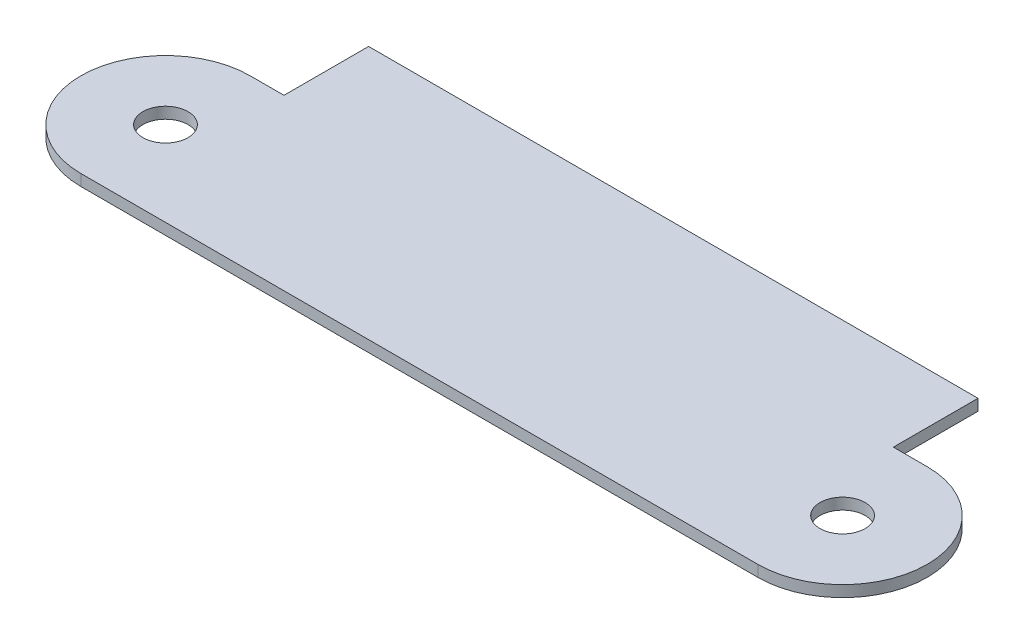
ISO-10303-21;
HEADER;
FILE_DESCRIPTION(('STEP AP214'),'2;1');
FILE_NAME('part.step','',(''),(''),'','','');
FILE_SCHEMA(('AUTOMOTIVE_DESIGN { 1 0 10303 214 1 1 1 1 }'));
ENDSEC;
DATA;
#1=APPLICATION_CONTEXT('core data for automotive mechanical design processes');
#2=APPLICATION_PROTOCOL_DEFINITION('international standard','automotive_design',2000,#1);
#3=PRODUCT_CONTEXT('',#1,'mechanical');
#4=PRODUCT('Part','Part','',(#3));
#5=PRODUCT_RELATED_PRODUCT_CATEGORY('part','',(#4));
#6=PRODUCT_DEFINITION_FORMATION('','',#4);
#7=PRODUCT_DEFINITION_CONTEXT('part definition',#1,'design');
#8=PRODUCT_DEFINITION('design','',#6,#7);
#9=PRODUCT_DEFINITION_SHAPE('','',#8);
#10=(LENGTH_UNIT() NAMED_UNIT(*) SI_UNIT(.MILLI.,.METRE.));
#11=(NAMED_UNIT(*) PLANE_ANGLE_UNIT() SI_UNIT($,.RADIAN.));
#12=(NAMED_UNIT(*) SI_UNIT($,.STERADIAN.) SOLID_ANGLE_UNIT());
#13=UNCERTAINTY_MEASURE_WITH_UNIT(LENGTH_MEASURE(1.E-05),#10,'distance_accuracy_value','');
#14=(GEOMETRIC_REPRESENTATION_CONTEXT(3) GLOBAL_UNCERTAINTY_ASSIGNED_CONTEXT((#13)) GLOBAL_UNIT_ASSIGNED_CONTEXT((#10,
#11,#12)) REPRESENTATION_CONTEXT('',''));
#15=CARTESIAN_POINT('',(0.,0.,0.));
#16=DIRECTION('',(0.,0.,1.));
#17=DIRECTION('',(1.,0.,0.));
#18=AXIS2_PLACEMENT_3D('',#15,#16,#17);
#19=CARTESIAN_POINT('',(60.,1.,0.));
#20=DIRECTION('',(0.,-1.,0.));
#21=DIRECTION('',(0.,0.,-1.));
#22=AXIS2_PLACEMENT_3D('',#19,#20,#21);
#23=CYLINDRICAL_SURFACE('',#22,7.5);
#24=CARTESIAN_POINT('',(60.,0.,0.));
#25=DIRECTION('',(0.,1.,0.));
#26=DIRECTION('',(0.,0.,1.));
#27=AXIS2_PLACEMENT_3D('',#24,#25,#26);
#28=CIRCLE('',#27,7.5);
#29=CARTESIAN_POINT('',(60.,0.,-7.5));
#30=VERTEX_POINT('',#29);
#31=CARTESIAN_POINT('',(60.,0.,7.5));
#32=VERTEX_POINT('',#31);
#33=EDGE_CURVE('E135',#30,#32,#28,.F.);
#34=ORIENTED_EDGE('',*,*,#33,.F.);
#35=DIRECTION('',(0.,-1.,0.));
#36=VECTOR('',#35,1.);
#37=CARTESIAN_POINT('',(60.,1.,-7.5));
#38=LINE('',#37,#36);
#39=CARTESIAN_POINT('',(60.,1.,-7.5));
#40=VERTEX_POINT('',#39);
#41=EDGE_CURVE('E11',#40,#30,#38,.T.);
#42=ORIENTED_EDGE('',*,*,#41,.F.);
#43=CARTESIAN_POINT('',(60.,1.,0.));
#44=DIRECTION('',(0.,1.,0.));
#45=DIRECTION('',(0.,0.,1.));
#46=AXIS2_PLACEMENT_3D('',#43,#44,#45);
#47=CIRCLE('',#46,7.5);
#48=CARTESIAN_POINT('',(60.,1.,7.5));
#49=VERTEX_POINT('',#48);
#50=EDGE_CURVE('E160',#40,#49,#47,.F.);
#51=ORIENTED_EDGE('',*,*,#50,.T.);
#52=DIRECTION('',(0.,-1.,0.));
#53=VECTOR('',#52,1.);
#54=CARTESIAN_POINT('',(60.,1.,7.5));
#55=LINE('',#54,#53);
#56=EDGE_CURVE('E84',#49,#32,#55,.T.);
#57=ORIENTED_EDGE('',*,*,#56,.T.);
#58=EDGE_LOOP('',(#34,#42,#51,#57));
#59=FACE_BOUND('',#58,.T.);
#60=ADVANCED_FACE('F34',(#59),#23,.T.);
#61=CARTESIAN_POINT('',(0.,1.,-7.5));
#62=DIRECTION('',(0.,0.,-1.));
#63=DIRECTION('',(-1.,0.,0.));
#64=AXIS2_PLACEMENT_3D('',#61,#62,#63);
#65=PLANE('',#64);
#66=DIRECTION('',(1.,0.,0.));
#67=VECTOR('',#66,1.);
#68=CARTESIAN_POINT('',(0.,0.,-7.5));
#69=LINE('',#68,#67);
#70=CARTESIAN_POINT('',(57.,0.,-7.5));
#71=VERTEX_POINT('',#70);
#72=EDGE_CURVE('E138',#71,#30,#69,.T.);
#73=ORIENTED_EDGE('',*,*,#72,.F.);
#74=DIRECTION('',(0.,-1.,0.));
#75=VECTOR('',#74,1.);
#76=CARTESIAN_POINT('',(57.,1.,-7.5));
#77=LINE('',#76,#75);
#78=CARTESIAN_POINT('',(57.,1.,-7.5));
#79=VERTEX_POINT('',#78);
#80=EDGE_CURVE('E42',#79,#71,#77,.T.);
#81=ORIENTED_EDGE('',*,*,#80,.F.);
#82=DIRECTION('',(1.,0.,0.));
#83=VECTOR('',#82,1.);
#84=CARTESIAN_POINT('',(0.,1.,-7.5));
#85=LINE('',#84,#83);
#86=EDGE_CURVE('E186',#79,#40,#85,.T.);
#87=ORIENTED_EDGE('',*,*,#86,.T.);
#88=ORIENTED_EDGE('',*,*,#41,.T.);
#89=EDGE_LOOP('',(#73,#81,#87,#88));
#90=FACE_BOUND('',#89,.T.);
#91=ADVANCED_FACE('F177',(#90),#65,.T.);
#92=CARTESIAN_POINT('',(57.,1.,0.));
#93=DIRECTION('',(1.,0.,0.));
#94=DIRECTION('',(0.,0.,-1.));
#95=AXIS2_PLACEMENT_3D('',#92,#93,#94);
#96=PLANE('',#95);
#97=DIRECTION('',(0.,0.,1.));
#98=VECTOR('',#97,1.);
#99=CARTESIAN_POINT('',(57.,0.,0.));
#100=LINE('',#99,#98);
#101=CARTESIAN_POINT('',(57.,0.,-15.));
#102=VERTEX_POINT('',#101);
#103=EDGE_CURVE('E141',#102,#71,#100,.T.);
#104=ORIENTED_EDGE('',*,*,#103,.F.);
#105=DIRECTION('',(0.,-1.,0.));
#106=VECTOR('',#105,1.);
#107=CARTESIAN_POINT('',(57.,1.,-15.));
#108=LINE('',#107,#106);
#109=CARTESIAN_POINT('',(57.,1.,-15.));
#110=VERTEX_POINT('',#109);
#111=EDGE_CURVE('E166',#110,#102,#108,.T.);
#112=ORIENTED_EDGE('',*,*,#111,.F.);
#113=DIRECTION('',(0.,0.,1.));
#114=VECTOR('',#113,1.);
#115=CARTESIAN_POINT('',(57.,1.,0.));
#116=LINE('',#115,#114);
#117=EDGE_CURVE('E173',#110,#79,#116,.T.);
#118=ORIENTED_EDGE('',*,*,#117,.T.);
#119=ORIENTED_EDGE('',*,*,#80,.T.);
#120=EDGE_LOOP('',(#104,#112,#118,#119));
#121=FACE_BOUND('',#120,.T.);
#122=ADVANCED_FACE('F171',(#121),#96,.T.);
#123=CARTESIAN_POINT('',(0.,1.,-15.));
#124=DIRECTION('',(0.,0.,-1.));
#125=DIRECTION('',(-1.,0.,0.));
#126=AXIS2_PLACEMENT_3D('',#123,#124,#125);
#127=PLANE('',#126);
#128=DIRECTION('',(1.,0.,0.));
#129=VECTOR('',#128,1.);
#130=CARTESIAN_POINT('',(0.,0.,-15.));
#131=LINE('',#130,#129);
#132=CARTESIAN_POINT('',(3.,0.,-15.));
#133=VERTEX_POINT('',#132);
#134=EDGE_CURVE('E144',#133,#102,#131,.T.);
#135=ORIENTED_EDGE('',*,*,#134,.F.);
#136=DIRECTION('',(0.,-1.,0.));
#137=VECTOR('',#136,1.);
#138=CARTESIAN_POINT('',(3.,1.,-15.));
#139=LINE('',#138,#137);
#140=CARTESIAN_POINT('',(3.,1.,-15.));
#141=VERTEX_POINT('',#140);
#142=EDGE_CURVE('E164',#141,#133,#139,.T.);
#143=ORIENTED_EDGE('',*,*,#142,.F.);
#144=DIRECTION('',(1.,0.,0.));
#145=VECTOR('',#144,1.);
#146=CARTESIAN_POINT('',(0.,1.,-15.));
#147=LINE('',#146,#145);
#148=EDGE_CURVE('E124',#141,#110,#147,.T.);
#149=ORIENTED_EDGE('',*,*,#148,.T.);
#150=ORIENTED_EDGE('',*,*,#111,.T.);
#151=EDGE_LOOP('',(#135,#143,#149,#150));
#152=FACE_BOUND('',#151,.T.);
#153=ADVANCED_FACE('F184',(#152),#127,.T.);
#154=CARTESIAN_POINT('',(3.,1.,0.));
#155=DIRECTION('',(-1.,0.,0.));
#156=DIRECTION('',(0.,0.,1.));
#157=AXIS2_PLACEMENT_3D('',#154,#155,#156);
#158=PLANE('',#157);
#159=DIRECTION('',(0.,0.,-1.));
#160=VECTOR('',#159,1.);
#161=CARTESIAN_POINT('',(3.,0.,0.));
#162=LINE('',#161,#160);
#163=CARTESIAN_POINT('',(3.,0.,-7.5));
#164=VERTEX_POINT('',#163);
#165=EDGE_CURVE('E147',#164,#133,#162,.T.);
#166=ORIENTED_EDGE('',*,*,#165,.F.);
#167=DIRECTION('',(0.,-1.,0.));
#168=VECTOR('',#167,1.);
#169=CARTESIAN_POINT('',(3.,1.,-7.5));
#170=LINE('',#169,#168);
#171=CARTESIAN_POINT('',(3.,1.,-7.5));
#172=VERTEX_POINT('',#171);
#173=EDGE_CURVE('E111',#172,#164,#170,.T.);
#174=ORIENTED_EDGE('',*,*,#173,.F.);
#175=DIRECTION('',(0.,0.,-1.));
#176=VECTOR('',#175,1.);
#177=CARTESIAN_POINT('',(3.,1.,0.));
#178=LINE('',#177,#176);
#179=EDGE_CURVE('E122',#172,#141,#178,.T.);
#180=ORIENTED_EDGE('',*,*,#179,.T.);
#181=ORIENTED_EDGE('',*,*,#142,.T.);
#182=EDGE_LOOP('',(#166,#174,#180,#181));
#183=FACE_BOUND('',#182,.T.);
#184=ADVANCED_FACE('F201',(#183),#158,.T.);
#185=CARTESIAN_POINT('',(0.,1.,-7.5));
#186=DIRECTION('',(0.,0.,-1.));
#187=DIRECTION('',(-1.,0.,0.));
#188=AXIS2_PLACEMENT_3D('',#185,#186,#187);
#189=PLANE('',#188);
#190=DIRECTION('',(1.,0.,0.));
#191=VECTOR('',#190,1.);
#192=CARTESIAN_POINT('',(0.,0.,-7.5));
#193=LINE('',#192,#191);
#194=CARTESIAN_POINT('',(0.,0.,-7.5));
#195=VERTEX_POINT('',#194);
#196=EDGE_CURVE('E110',#195,#164,#193,.T.);
#197=ORIENTED_EDGE('',*,*,#196,.F.);
#198=DIRECTION('',(0.,-1.,0.));
#199=VECTOR('',#198,1.);
#200=CARTESIAN_POINT('',(0.,1.,-7.5));
#201=LINE('',#200,#199);
#202=CARTESIAN_POINT('',(0.,1.,-7.5));
#203=VERTEX_POINT('',#202);
#204=EDGE_CURVE('E104',#203,#195,#201,.T.);
#205=ORIENTED_EDGE('',*,*,#204,.F.);
#206=DIRECTION('',(1.,0.,0.));
#207=VECTOR('',#206,1.);
#208=CARTESIAN_POINT('',(0.,1.,-7.5));
#209=LINE('',#208,#207);
#210=EDGE_CURVE('E108',#203,#172,#209,.T.);
#211=ORIENTED_EDGE('',*,*,#210,.T.);
#212=ORIENTED_EDGE('',*,*,#173,.T.);
#213=EDGE_LOOP('',(#197,#205,#211,#212));
#214=FACE_BOUND('',#213,.T.);
#215=ADVANCED_FACE('F106',(#214),#189,.T.);
#216=CARTESIAN_POINT('',(0.,1.,0.));
#217=DIRECTION('',(0.,-1.,0.));
#218=DIRECTION('',(0.,0.,-1.));
#219=AXIS2_PLACEMENT_3D('',#216,#217,#218);
#220=CYLINDRICAL_SURFACE('',#219,7.5);
#221=CARTESIAN_POINT('',(0.,0.,0.));
#222=DIRECTION('',(0.,1.,0.));
#223=DIRECTION('',(0.,0.,1.));
#224=AXIS2_PLACEMENT_3D('',#221,#222,#223);
#225=CIRCLE('',#224,7.5);
#226=CARTESIAN_POINT('',(0.,0.,7.5));
#227=VERTEX_POINT('',#226);
#228=EDGE_CURVE('E77',#195,#227,#225,.T.);
#229=ORIENTED_EDGE('',*,*,#228,.T.);
#230=DIRECTION('',(0.,-1.,0.));
#231=VECTOR('',#230,1.);
#232=CARTESIAN_POINT('',(0.,1.,7.5));
#233=LINE('',#232,#231);
#234=CARTESIAN_POINT('',(0.,1.,7.5));
#235=VERTEX_POINT('',#234);
#236=EDGE_CURVE('E112',#235,#227,#233,.T.);
#237=ORIENTED_EDGE('',*,*,#236,.F.);
#238=CARTESIAN_POINT('',(0.,1.,0.));
#239=DIRECTION('',(0.,1.,0.));
#240=DIRECTION('',(0.,0.,1.));
#241=AXIS2_PLACEMENT_3D('',#238,#239,#240);
#242=CIRCLE('',#241,7.5);
#243=EDGE_CURVE('E114',#203,#235,#242,.T.);
#244=ORIENTED_EDGE('',*,*,#243,.F.);
#245=ORIENTED_EDGE('',*,*,#204,.T.);
#246=EDGE_LOOP('',(#229,#237,#244,#245));
#247=FACE_BOUND('',#246,.T.);
#248=ADVANCED_FACE('F115',(#247),#220,.T.);
#249=CARTESIAN_POINT('',(60.,1.,0.));
#250=DIRECTION('',(0.,-1.,0.));
#251=DIRECTION('',(0.,0.,-1.));
#252=AXIS2_PLACEMENT_3D('',#249,#250,#251);
#253=CYLINDRICAL_SURFACE('',#252,2.);
#254=CARTESIAN_POINT('',(60.,1.,0.));
#255=DIRECTION('',(0.,1.,0.));
#256=DIRECTION('',(0.,0.,1.));
#257=AXIS2_PLACEMENT_3D('',#254,#255,#256);
#258=CIRCLE('',#257,2.);
#259=CARTESIAN_POINT('',(60.,1.,2.));
#260=VERTEX_POINT('',#259);
#261=EDGE_CURVE('E129',#260,#260,#258,.T.);
#262=ORIENTED_EDGE('',*,*,#261,.T.);
#263=EDGE_LOOP('',(#262));
#264=FACE_BOUND('',#263,.T.);
#265=CARTESIAN_POINT('',(60.,0.,0.));
#266=DIRECTION('',(0.,1.,0.));
#267=DIRECTION('',(0.,0.,1.));
#268=AXIS2_PLACEMENT_3D('',#265,#266,#267);
#269=CIRCLE('',#268,2.);
#270=CARTESIAN_POINT('',(60.,0.,2.));
#271=VERTEX_POINT('',#270);
#272=EDGE_CURVE('E154',#271,#271,#269,.T.);
#273=ORIENTED_EDGE('',*,*,#272,.F.);
#274=EDGE_LOOP('',(#273));
#275=FACE_BOUND('',#274,.T.);
#276=ADVANCED_FACE('F209',(#264,#275),#253,.F.);
#277=CARTESIAN_POINT('',(0.,1.,7.5));
#278=DIRECTION('',(0.,0.,-1.));
#279=DIRECTION('',(-1.,0.,0.));
#280=AXIS2_PLACEMENT_3D('',#277,#278,#279);
#281=PLANE('',#280);
#282=DIRECTION('',(1.,0.,0.));
#283=VECTOR('',#282,1.);
#284=CARTESIAN_POINT('',(0.,0.,7.5));
#285=LINE('',#284,#283);
#286=EDGE_CURVE('E152',#227,#32,#285,.T.);
#287=ORIENTED_EDGE('',*,*,#286,.T.);
#288=ORIENTED_EDGE('',*,*,#56,.F.);
#289=DIRECTION('',(1.,0.,0.));
#290=VECTOR('',#289,1.);
#291=CARTESIAN_POINT('',(0.,1.,7.5));
#292=LINE('',#291,#290);
#293=EDGE_CURVE('E50',#235,#49,#292,.T.);
#294=ORIENTED_EDGE('',*,*,#293,.F.);
#295=ORIENTED_EDGE('',*,*,#236,.T.);
#296=EDGE_LOOP('',(#287,#288,#294,#295));
#297=FACE_BOUND('',#296,.T.);
#298=ADVANCED_FACE('F210',(#297),#281,.F.);
#299=CARTESIAN_POINT('',(0.,1.,0.));
#300=DIRECTION('',(0.,-1.,0.));
#301=DIRECTION('',(0.,0.,-1.));
#302=AXIS2_PLACEMENT_3D('',#299,#300,#301);
#303=CYLINDRICAL_SURFACE('',#302,2.);
#304=CARTESIAN_POINT('',(0.,1.,0.));
#305=DIRECTION('',(0.,1.,0.));
#306=DIRECTION('',(0.,0.,1.));
#307=AXIS2_PLACEMENT_3D('',#304,#305,#306);
#308=CIRCLE('',#307,2.);
#309=CARTESIAN_POINT('',(0.,1.,2.));
#310=VERTEX_POINT('',#309);
#311=EDGE_CURVE('E132',#310,#310,#308,.T.);
#312=ORIENTED_EDGE('',*,*,#311,.T.);
#313=EDGE_LOOP('',(#312));
#314=FACE_BOUND('',#313,.T.);
#315=CARTESIAN_POINT('',(0.,0.,0.));
#316=DIRECTION('',(0.,1.,0.));
#317=DIRECTION('',(0.,0.,1.));
#318=AXIS2_PLACEMENT_3D('',#315,#316,#317);
#319=CIRCLE('',#318,2.);
#320=CARTESIAN_POINT('',(0.,0.,2.));
#321=VERTEX_POINT('',#320);
#322=EDGE_CURVE('E157',#321,#321,#319,.T.);
#323=ORIENTED_EDGE('',*,*,#322,.F.);
#324=EDGE_LOOP('',(#323));
#325=FACE_BOUND('',#324,.T.);
#326=ADVANCED_FACE('F213',(#314,#325),#303,.F.);
#327=CARTESIAN_POINT('',(0.,1.,0.));
#328=DIRECTION('',(0.,1.,0.));
#329=DIRECTION('',(0.,0.,1.));
#330=AXIS2_PLACEMENT_3D('',#327,#328,#329);
#331=PLANE('',#330);
#332=ORIENTED_EDGE('',*,*,#50,.F.);
#333=ORIENTED_EDGE('',*,*,#86,.F.);
#334=ORIENTED_EDGE('',*,*,#117,.F.);
#335=ORIENTED_EDGE('',*,*,#148,.F.);
#336=ORIENTED_EDGE('',*,*,#179,.F.);
#337=ORIENTED_EDGE('',*,*,#210,.F.);
#338=ORIENTED_EDGE('',*,*,#243,.T.);
#339=ORIENTED_EDGE('',*,*,#293,.T.);
#340=EDGE_LOOP('',(#332,#333,#334,#335,#336,#337,#338,#339));
#341=FACE_BOUND('',#340,.T.);
#342=ORIENTED_EDGE('',*,*,#261,.F.);
#343=EDGE_LOOP('',(#342));
#344=FACE_BOUND('',#343,.T.);
#345=ORIENTED_EDGE('',*,*,#311,.F.);
#346=EDGE_LOOP('',(#345));
#347=FACE_BOUND('',#346,.T.);
#348=ADVANCED_FACE('F118',(#341,#344,#347),#331,.T.);
#349=CARTESIAN_POINT('',(0.,0.,0.));
#350=DIRECTION('',(0.,1.,0.));
#351=DIRECTION('',(0.,0.,1.));
#352=AXIS2_PLACEMENT_3D('',#349,#350,#351);
#353=PLANE('',#352);
#354=ORIENTED_EDGE('',*,*,#33,.T.);
#355=ORIENTED_EDGE('',*,*,#286,.F.);
#356=ORIENTED_EDGE('',*,*,#228,.F.);
#357=ORIENTED_EDGE('',*,*,#196,.T.);
#358=ORIENTED_EDGE('',*,*,#165,.T.);
#359=ORIENTED_EDGE('',*,*,#134,.T.);
#360=ORIENTED_EDGE('',*,*,#103,.T.);
#361=ORIENTED_EDGE('',*,*,#72,.T.);
#362=EDGE_LOOP('',(#354,#355,#356,#357,#358,#359,#360,#361));
#363=FACE_BOUND('',#362,.T.);
#364=ORIENTED_EDGE('',*,*,#272,.T.);
#365=EDGE_LOOP('',(#364));
#366=FACE_BOUND('',#365,.T.);
#367=ORIENTED_EDGE('',*,*,#322,.T.);
#368=EDGE_LOOP('',(#367));
#369=FACE_BOUND('',#368,.T.);
#370=ADVANCED_FACE('F179',(#363,#366,#369),#353,.F.);
#371=CLOSED_SHELL('',(#60,#91,#122,#153,#184,#215,#248,#276,#298,#326,#348,#370));
#372=MANIFOLD_SOLID_BREP('B2',#371);
#373=ADVANCED_BREP_SHAPE_REPRESENTATION('',(#18,#372),#14);
#374=SHAPE_DEFINITION_REPRESENTATION(#9,#373);
ENDSEC;
END-ISO-10303-21;
